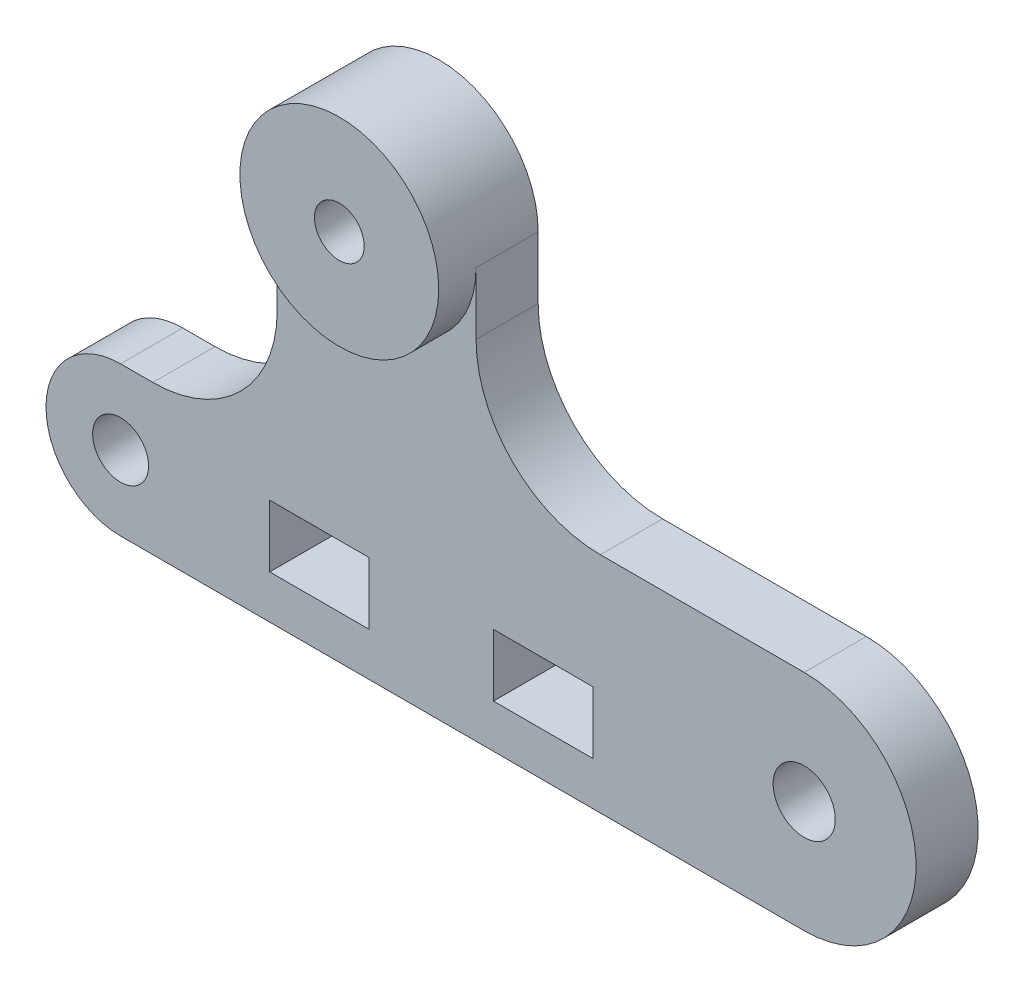
ISO-10303-21;
HEADER;
FILE_DESCRIPTION(('STEP AP214'),'2;1');
FILE_NAME('part.step','',(''),(''),'','','');
FILE_SCHEMA(('AUTOMOTIVE_DESIGN { 1 0 10303 214 1 1 1 1 }'));
ENDSEC;
DATA;
#1=APPLICATION_CONTEXT('core data for automotive mechanical design processes');
#2=APPLICATION_PROTOCOL_DEFINITION('international standard','automotive_design',2000,#1);
#3=PRODUCT_CONTEXT('',#1,'mechanical');
#4=PRODUCT('Part','Part','',(#3));
#5=PRODUCT_RELATED_PRODUCT_CATEGORY('part','',(#4));
#6=PRODUCT_DEFINITION_FORMATION('','',#4);
#7=PRODUCT_DEFINITION_CONTEXT('part definition',#1,'design');
#8=PRODUCT_DEFINITION('design','',#6,#7);
#9=PRODUCT_DEFINITION_SHAPE('','',#8);
#10=(LENGTH_UNIT() NAMED_UNIT(*) SI_UNIT(.MILLI.,.METRE.));
#11=(NAMED_UNIT(*) PLANE_ANGLE_UNIT() SI_UNIT($,.RADIAN.));
#12=(NAMED_UNIT(*) SI_UNIT($,.STERADIAN.) SOLID_ANGLE_UNIT());
#13=UNCERTAINTY_MEASURE_WITH_UNIT(LENGTH_MEASURE(1.E-05),#10,'distance_accuracy_value','');
#14=(GEOMETRIC_REPRESENTATION_CONTEXT(3) GLOBAL_UNCERTAINTY_ASSIGNED_CONTEXT((#13)) GLOBAL_UNIT_ASSIGNED_CONTEXT((#10,
#11,#12)) REPRESENTATION_CONTEXT('',''));
#15=CARTESIAN_POINT('',(0.,0.,0.));
#16=DIRECTION('',(0.,0.,1.));
#17=DIRECTION('',(1.,0.,0.));
#18=AXIS2_PLACEMENT_3D('',#15,#16,#17);
#19=CARTESIAN_POINT('',(-27.5,6.,2.5));
#20=DIRECTION('',(0.,0.,-1.));
#21=DIRECTION('',(-1.,0.,0.));
#22=AXIS2_PLACEMENT_3D('',#19,#20,#21);
#23=PLANE('',#22);
#24=CARTESIAN_POINT('',(-6.90000000000001,33.,2.5));
#25=DIRECTION('',(0.,0.,1.));
#26=DIRECTION('',(1.,0.,0.));
#27=AXIS2_PLACEMENT_3D('',#24,#25,#26);
#28=CIRCLE('',#27,8.);
#29=CARTESIAN_POINT('',(-14.9,33.,2.5));
#30=VERTEX_POINT('',#29);
#31=CARTESIAN_POINT('',(1.09999999999999,33.,2.5));
#32=VERTEX_POINT('',#31);
#33=EDGE_CURVE('E11',#30,#32,#28,.T.);
#34=ORIENTED_EDGE('',*,*,#33,.F.);
#35=DIRECTION('',(0.,-1.,0.));
#36=VECTOR('',#35,1.);
#37=CARTESIAN_POINT('',(-14.9,33.,2.5));
#38=LINE('',#37,#36);
#39=CARTESIAN_POINT('',(-14.9,22.0000000000001,2.5));
#40=VERTEX_POINT('',#39);
#41=EDGE_CURVE('E181',#30,#40,#38,.T.);
#42=ORIENTED_EDGE('',*,*,#41,.T.);
#43=CARTESIAN_POINT('',(-24.9,22.,2.5));
#44=DIRECTION('',(0.,0.,-1.));
#45=DIRECTION('',(-1.,0.,0.));
#46=AXIS2_PLACEMENT_3D('',#43,#44,#45);
#47=CIRCLE('',#46,10.);
#48=CARTESIAN_POINT('',(-24.9000000000001,12.,2.5));
#49=VERTEX_POINT('',#48);
#50=EDGE_CURVE('E196',#40,#49,#47,.T.);
#51=ORIENTED_EDGE('',*,*,#50,.T.);
#52=DIRECTION('',(-1.,0.,0.));
#53=VECTOR('',#52,1.);
#54=CARTESIAN_POINT('',(-24.9000000000001,12.,2.5));
#55=LINE('',#54,#53);
#56=CARTESIAN_POINT('',(-27.5,12.,2.5));
#57=VERTEX_POINT('',#56);
#58=EDGE_CURVE('E198',#49,#57,#55,.T.);
#59=ORIENTED_EDGE('',*,*,#58,.T.);
#60=CARTESIAN_POINT('',(-27.5,6.,2.5));
#61=DIRECTION('',(0.,0.,1.));
#62=DIRECTION('',(-1.,0.,0.));
#63=AXIS2_PLACEMENT_3D('',#60,#61,#62);
#64=CIRCLE('',#63,6.);
#65=CARTESIAN_POINT('',(-27.5,0.,2.5));
#66=VERTEX_POINT('',#65);
#67=EDGE_CURVE('E224',#57,#66,#64,.T.);
#68=ORIENTED_EDGE('',*,*,#67,.T.);
#69=DIRECTION('',(1.,0.,0.));
#70=VECTOR('',#69,1.);
#71=CARTESIAN_POINT('',(-27.5,0.,2.5));
#72=LINE('',#71,#70);
#73=CARTESIAN_POINT('',(27.5,0.,2.5));
#74=VERTEX_POINT('',#73);
#75=EDGE_CURVE('E247',#66,#74,#72,.T.);
#76=ORIENTED_EDGE('',*,*,#75,.T.);
#77=CARTESIAN_POINT('',(27.5,9.,2.5));
#78=DIRECTION('',(0.,0.,1.));
#79=DIRECTION('',(1.,0.,0.));
#80=AXIS2_PLACEMENT_3D('',#77,#78,#79);
#81=CIRCLE('',#80,8.99999999999999);
#82=CARTESIAN_POINT('',(27.5,18.,2.5));
#83=VERTEX_POINT('',#82);
#84=EDGE_CURVE('E267',#74,#83,#81,.T.);
#85=ORIENTED_EDGE('',*,*,#84,.T.);
#86=DIRECTION('',(-1.,0.,0.));
#87=VECTOR('',#86,1.);
#88=CARTESIAN_POINT('',(11.1000000000001,18.,2.5));
#89=LINE('',#88,#87);
#90=CARTESIAN_POINT('',(11.1000000000001,18.,2.5));
#91=VERTEX_POINT('',#90);
#92=EDGE_CURVE('E266',#83,#91,#89,.T.);
#93=ORIENTED_EDGE('',*,*,#92,.T.);
#94=CARTESIAN_POINT('',(11.1,28.,2.5));
#95=DIRECTION('',(0.,0.,-1.));
#96=DIRECTION('',(1.,0.,0.));
#97=AXIS2_PLACEMENT_3D('',#94,#95,#96);
#98=CIRCLE('',#97,10.);
#99=CARTESIAN_POINT('',(1.09999999999999,28.0000000000001,2.5));
#100=VERTEX_POINT('',#99);
#101=EDGE_CURVE('E179',#91,#100,#98,.T.);
#102=ORIENTED_EDGE('',*,*,#101,.T.);
#103=DIRECTION('',(0.,1.,0.));
#104=VECTOR('',#103,1.);
#105=CARTESIAN_POINT('',(1.09999999999999,33.,2.5));
#106=LINE('',#105,#104);
#107=EDGE_CURVE('E167',#100,#32,#106,.T.);
#108=ORIENTED_EDGE('',*,*,#107,.T.);
#109=EDGE_LOOP('',(#34,#42,#51,#59,#68,#76,#85,#93,#102,#108));
#110=FACE_BOUND('',#109,.T.);
#111=DIRECTION('',(0.,-1.,0.));
#112=VECTOR('',#111,1.);
#113=CARTESIAN_POINT('',(-15.5,3.5,2.5));
#114=LINE('',#113,#112);
#115=CARTESIAN_POINT('',(-15.5,8.5,2.5));
#116=VERTEX_POINT('',#115);
#117=CARTESIAN_POINT('',(-15.5,3.5,2.5));
#118=VERTEX_POINT('',#117);
#119=EDGE_CURVE('E305',#116,#118,#114,.T.);
#120=ORIENTED_EDGE('',*,*,#119,.F.);
#121=DIRECTION('',(-1.,0.,0.));
#122=VECTOR('',#121,1.);
#123=CARTESIAN_POINT('',(-15.5,8.5,2.5));
#124=LINE('',#123,#122);
#125=CARTESIAN_POINT('',(-7.5,8.5,2.5));
#126=VERTEX_POINT('',#125);
#127=EDGE_CURVE('E301',#126,#116,#124,.T.);
#128=ORIENTED_EDGE('',*,*,#127,.F.);
#129=DIRECTION('',(0.,1.,0.));
#130=VECTOR('',#129,1.);
#131=CARTESIAN_POINT('',(-7.5,3.5,2.5));
#132=LINE('',#131,#130);
#133=CARTESIAN_POINT('',(-7.5,3.5,2.5));
#134=VERTEX_POINT('',#133);
#135=EDGE_CURVE('E317',#134,#126,#132,.T.);
#136=ORIENTED_EDGE('',*,*,#135,.F.);
#137=DIRECTION('',(1.,0.,0.));
#138=VECTOR('',#137,1.);
#139=CARTESIAN_POINT('',(-15.5,3.5,2.5));
#140=LINE('',#139,#138);
#141=EDGE_CURVE('E320',#118,#134,#140,.T.);
#142=ORIENTED_EDGE('',*,*,#141,.F.);
#143=EDGE_LOOP('',(#120,#128,#136,#142));
#144=FACE_BOUND('',#143,.T.);
#145=CARTESIAN_POINT('',(-27.5,6.,2.5));
#146=DIRECTION('',(0.,0.,1.));
#147=DIRECTION('',(1.,0.,0.));
#148=AXIS2_PLACEMENT_3D('',#145,#146,#147);
#149=CIRCLE('',#148,2.25);
#150=CARTESIAN_POINT('',(-25.25,6.,2.5));
#151=VERTEX_POINT('',#150);
#152=EDGE_CURVE('E208',#151,#151,#149,.T.);
#153=ORIENTED_EDGE('',*,*,#152,.F.);
#154=EDGE_LOOP('',(#153));
#155=FACE_BOUND('',#154,.T.);
#156=CARTESIAN_POINT('',(27.5,9.,2.5));
#157=DIRECTION('',(0.,0.,1.));
#158=DIRECTION('',(1.,0.,0.));
#159=AXIS2_PLACEMENT_3D('',#156,#157,#158);
#160=CIRCLE('',#159,2.5);
#161=CARTESIAN_POINT('',(30.,9.,2.5));
#162=VERTEX_POINT('',#161);
#163=EDGE_CURVE('E281',#162,#162,#160,.T.);
#164=ORIENTED_EDGE('',*,*,#163,.F.);
#165=EDGE_LOOP('',(#164));
#166=FACE_BOUND('',#165,.T.);
#167=DIRECTION('',(0.,-1.,0.));
#168=VECTOR('',#167,1.);
#169=CARTESIAN_POINT('',(2.5,8.5,2.5));
#170=LINE('',#169,#168);
#171=CARTESIAN_POINT('',(2.5,8.5,2.5));
#172=VERTEX_POINT('',#171);
#173=CARTESIAN_POINT('',(2.5,3.5,2.5));
#174=VERTEX_POINT('',#173);
#175=EDGE_CURVE('E333',#172,#174,#170,.T.);
#176=ORIENTED_EDGE('',*,*,#175,.F.);
#177=DIRECTION('',(-1.,0.,0.));
#178=VECTOR('',#177,1.);
#179=CARTESIAN_POINT('',(2.5,8.5,2.5));
#180=LINE('',#179,#178);
#181=CARTESIAN_POINT('',(10.5,8.5,2.5));
#182=VERTEX_POINT('',#181);
#183=EDGE_CURVE('E329',#182,#172,#180,.T.);
#184=ORIENTED_EDGE('',*,*,#183,.F.);
#185=DIRECTION('',(0.,1.,0.));
#186=VECTOR('',#185,1.);
#187=CARTESIAN_POINT('',(10.5,8.5,2.5));
#188=LINE('',#187,#186);
#189=CARTESIAN_POINT('',(10.5,3.5,2.5));
#190=VERTEX_POINT('',#189);
#191=EDGE_CURVE('E342',#190,#182,#188,.T.);
#192=ORIENTED_EDGE('',*,*,#191,.F.);
#193=DIRECTION('',(1.,0.,0.));
#194=VECTOR('',#193,1.);
#195=CARTESIAN_POINT('',(2.5,3.5,2.5));
#196=LINE('',#195,#194);
#197=EDGE_CURVE('E344',#174,#190,#196,.T.);
#198=ORIENTED_EDGE('',*,*,#197,.F.);
#199=EDGE_LOOP('',(#176,#184,#192,#198));
#200=FACE_BOUND('',#199,.T.);
#201=ADVANCED_FACE('F35',(#110,#144,#155,#166,#200),#23,.F.);
#202=CARTESIAN_POINT('',(-27.5,6.,-2.5));
#203=DIRECTION('',(0.,0.,-1.));
#204=DIRECTION('',(-1.,0.,0.));
#205=AXIS2_PLACEMENT_3D('',#202,#203,#204);
#206=PLANE('',#205);
#207=CARTESIAN_POINT('',(-6.90000000000001,33.,-2.5));
#208=DIRECTION('',(0.,0.,1.));
#209=DIRECTION('',(1.,0.,0.));
#210=AXIS2_PLACEMENT_3D('',#207,#208,#209);
#211=CIRCLE('',#210,2.25);
#212=CARTESIAN_POINT('',(-4.65,33.,-2.5));
#213=VERTEX_POINT('',#212);
#214=EDGE_CURVE('E276',#213,#213,#211,.T.);
#215=ORIENTED_EDGE('',*,*,#214,.T.);
#216=EDGE_LOOP('',(#215));
#217=FACE_BOUND('',#216,.T.);
#218=CARTESIAN_POINT('',(-27.5,6.,-2.5));
#219=DIRECTION('',(0.,0.,1.));
#220=DIRECTION('',(-1.,0.,0.));
#221=AXIS2_PLACEMENT_3D('',#218,#219,#220);
#222=CIRCLE('',#221,6.);
#223=CARTESIAN_POINT('',(-27.5,12.,-2.5));
#224=VERTEX_POINT('',#223);
#225=CARTESIAN_POINT('',(-27.5,0.,-2.5));
#226=VERTEX_POINT('',#225);
#227=EDGE_CURVE('E204',#224,#226,#222,.T.);
#228=ORIENTED_EDGE('',*,*,#227,.F.);
#229=DIRECTION('',(-1.,0.,0.));
#230=VECTOR('',#229,1.);
#231=CARTESIAN_POINT('',(-24.9000000000001,12.,-2.5));
#232=LINE('',#231,#230);
#233=CARTESIAN_POINT('',(-24.9000000000001,12.,-2.5));
#234=VERTEX_POINT('',#233);
#235=EDGE_CURVE('E222',#234,#224,#232,.T.);
#236=ORIENTED_EDGE('',*,*,#235,.F.);
#237=CARTESIAN_POINT('',(-24.9,22.,-2.5));
#238=DIRECTION('',(0.,0.,-1.));
#239=DIRECTION('',(-1.,0.,0.));
#240=AXIS2_PLACEMENT_3D('',#237,#238,#239);
#241=CIRCLE('',#240,10.);
#242=CARTESIAN_POINT('',(-14.9,22.0000000000001,-2.5));
#243=VERTEX_POINT('',#242);
#244=EDGE_CURVE('E220',#243,#234,#241,.T.);
#245=ORIENTED_EDGE('',*,*,#244,.F.);
#246=DIRECTION('',(0.,-1.,0.));
#247=VECTOR('',#246,1.);
#248=CARTESIAN_POINT('',(-14.9,33.,-2.5));
#249=LINE('',#248,#247);
#250=CARTESIAN_POINT('',(-14.9,33.,-2.5));
#251=VERTEX_POINT('',#250);
#252=EDGE_CURVE('E218',#251,#243,#249,.T.);
#253=ORIENTED_EDGE('',*,*,#252,.F.);
#254=CARTESIAN_POINT('',(-6.90000000000001,33.,-2.5));
#255=DIRECTION('',(0.,0.,1.));
#256=DIRECTION('',(-1.,0.,0.));
#257=AXIS2_PLACEMENT_3D('',#254,#255,#256);
#258=CIRCLE('',#257,8.);
#259=CARTESIAN_POINT('',(1.09999999999999,33.,-2.5));
#260=VERTEX_POINT('',#259);
#261=EDGE_CURVE('E187',#260,#251,#258,.T.);
#262=ORIENTED_EDGE('',*,*,#261,.F.);
#263=DIRECTION('',(0.,1.,0.));
#264=VECTOR('',#263,1.);
#265=CARTESIAN_POINT('',(1.09999999999999,33.,-2.5));
#266=LINE('',#265,#264);
#267=CARTESIAN_POINT('',(1.09999999999999,28.0000000000001,-2.5));
#268=VERTEX_POINT('',#267);
#269=EDGE_CURVE('E169',#268,#260,#266,.T.);
#270=ORIENTED_EDGE('',*,*,#269,.F.);
#271=CARTESIAN_POINT('',(11.1,28.,-2.5));
#272=DIRECTION('',(0.,0.,-1.));
#273=DIRECTION('',(1.,0.,0.));
#274=AXIS2_PLACEMENT_3D('',#271,#272,#273);
#275=CIRCLE('',#274,10.);
#276=CARTESIAN_POINT('',(11.1000000000001,18.,-2.5));
#277=VERTEX_POINT('',#276);
#278=EDGE_CURVE('E214',#277,#268,#275,.T.);
#279=ORIENTED_EDGE('',*,*,#278,.F.);
#280=DIRECTION('',(-1.,0.,0.));
#281=VECTOR('',#280,1.);
#282=CARTESIAN_POINT('',(11.1000000000001,18.,-2.5));
#283=LINE('',#282,#281);
#284=CARTESIAN_POINT('',(27.5,18.,-2.5));
#285=VERTEX_POINT('',#284);
#286=EDGE_CURVE('E212',#285,#277,#283,.T.);
#287=ORIENTED_EDGE('',*,*,#286,.F.);
#288=CARTESIAN_POINT('',(27.5,9.,-2.5));
#289=DIRECTION('',(0.,0.,1.));
#290=DIRECTION('',(1.,0.,0.));
#291=AXIS2_PLACEMENT_3D('',#288,#289,#290);
#292=CIRCLE('',#291,8.99999999999999);
#293=CARTESIAN_POINT('',(27.5,0.,-2.5));
#294=VERTEX_POINT('',#293);
#295=EDGE_CURVE('E210',#294,#285,#292,.T.);
#296=ORIENTED_EDGE('',*,*,#295,.F.);
#297=DIRECTION('',(1.,0.,0.));
#298=VECTOR('',#297,1.);
#299=CARTESIAN_POINT('',(-27.5,0.,-2.5));
#300=LINE('',#299,#298);
#301=EDGE_CURVE('E207',#226,#294,#300,.T.);
#302=ORIENTED_EDGE('',*,*,#301,.F.);
#303=EDGE_LOOP('',(#228,#236,#245,#253,#262,#270,#279,#287,#296,#302));
#304=FACE_BOUND('',#303,.T.);
#305=CARTESIAN_POINT('',(-27.5,6.,-2.5));
#306=DIRECTION('',(0.,0.,1.));
#307=DIRECTION('',(1.,0.,0.));
#308=AXIS2_PLACEMENT_3D('',#305,#306,#307);
#309=CIRCLE('',#308,2.25);
#310=CARTESIAN_POINT('',(-25.25,6.,-2.5));
#311=VERTEX_POINT('',#310);
#312=EDGE_CURVE('E273',#311,#311,#309,.T.);
#313=ORIENTED_EDGE('',*,*,#312,.T.);
#314=EDGE_LOOP('',(#313));
#315=FACE_BOUND('',#314,.T.);
#316=CARTESIAN_POINT('',(27.5,9.,-2.5));
#317=DIRECTION('',(0.,0.,1.));
#318=DIRECTION('',(1.,0.,0.));
#319=AXIS2_PLACEMENT_3D('',#316,#317,#318);
#320=CIRCLE('',#319,2.5);
#321=CARTESIAN_POINT('',(30.,9.,-2.5));
#322=VERTEX_POINT('',#321);
#323=EDGE_CURVE('E286',#322,#322,#320,.T.);
#324=ORIENTED_EDGE('',*,*,#323,.T.);
#325=EDGE_LOOP('',(#324));
#326=FACE_BOUND('',#325,.T.);
#327=DIRECTION('',(-1.,0.,0.));
#328=VECTOR('',#327,1.);
#329=CARTESIAN_POINT('',(-15.5,8.5,-2.5));
#330=LINE('',#329,#328);
#331=CARTESIAN_POINT('',(-7.5,8.5,-2.5));
#332=VERTEX_POINT('',#331);
#333=CARTESIAN_POINT('',(-15.5,8.5,-2.5));
#334=VERTEX_POINT('',#333);
#335=EDGE_CURVE('E302',#332,#334,#330,.T.);
#336=ORIENTED_EDGE('',*,*,#335,.T.);
#337=DIRECTION('',(0.,-1.,0.));
#338=VECTOR('',#337,1.);
#339=CARTESIAN_POINT('',(-15.5,3.5,-2.5));
#340=LINE('',#339,#338);
#341=CARTESIAN_POINT('',(-15.5,3.5,-2.5));
#342=VERTEX_POINT('',#341);
#343=EDGE_CURVE('E312',#334,#342,#340,.T.);
#344=ORIENTED_EDGE('',*,*,#343,.T.);
#345=DIRECTION('',(1.,0.,0.));
#346=VECTOR('',#345,1.);
#347=CARTESIAN_POINT('',(-15.5,3.5,-2.5));
#348=LINE('',#347,#346);
#349=CARTESIAN_POINT('',(-7.5,3.5,-2.5));
#350=VERTEX_POINT('',#349);
#351=EDGE_CURVE('E309',#342,#350,#348,.T.);
#352=ORIENTED_EDGE('',*,*,#351,.T.);
#353=DIRECTION('',(0.,1.,0.));
#354=VECTOR('',#353,1.);
#355=CARTESIAN_POINT('',(-7.5,3.5,-2.5));
#356=LINE('',#355,#354);
#357=EDGE_CURVE('E306',#350,#332,#356,.T.);
#358=ORIENTED_EDGE('',*,*,#357,.T.);
#359=EDGE_LOOP('',(#336,#344,#352,#358));
#360=FACE_BOUND('',#359,.T.);
#361=DIRECTION('',(-1.,0.,0.));
#362=VECTOR('',#361,1.);
#363=CARTESIAN_POINT('',(2.5,8.5,-2.5));
#364=LINE('',#363,#362);
#365=CARTESIAN_POINT('',(10.5,8.5,-2.5));
#366=VERTEX_POINT('',#365);
#367=CARTESIAN_POINT('',(2.5,8.5,-2.5));
#368=VERTEX_POINT('',#367);
#369=EDGE_CURVE('E330',#366,#368,#364,.T.);
#370=ORIENTED_EDGE('',*,*,#369,.T.);
#371=DIRECTION('',(0.,-1.,0.));
#372=VECTOR('',#371,1.);
#373=CARTESIAN_POINT('',(2.5,8.5,-2.5));
#374=LINE('',#373,#372);
#375=CARTESIAN_POINT('',(2.5,3.5,-2.5));
#376=VERTEX_POINT('',#375);
#377=EDGE_CURVE('E59',#368,#376,#374,.T.);
#378=ORIENTED_EDGE('',*,*,#377,.T.);
#379=DIRECTION('',(1.,0.,0.));
#380=VECTOR('',#379,1.);
#381=CARTESIAN_POINT('',(2.5,3.5,-2.5));
#382=LINE('',#381,#380);
#383=CARTESIAN_POINT('',(10.5,3.5,-2.5));
#384=VERTEX_POINT('',#383);
#385=EDGE_CURVE('E337',#376,#384,#382,.T.);
#386=ORIENTED_EDGE('',*,*,#385,.T.);
#387=DIRECTION('',(0.,1.,0.));
#388=VECTOR('',#387,1.);
#389=CARTESIAN_POINT('',(10.5,8.5,-2.5));
#390=LINE('',#389,#388);
#391=EDGE_CURVE('E334',#384,#366,#390,.T.);
#392=ORIENTED_EDGE('',*,*,#391,.T.);
#393=EDGE_LOOP('',(#370,#378,#386,#392));
#394=FACE_BOUND('',#393,.T.);
#395=ADVANCED_FACE('F255',(#217,#304,#315,#326,#360,#394),#206,.T.);
#396=CARTESIAN_POINT('',(-27.5,6.,2.5));
#397=DIRECTION('',(0.,0.,-1.));
#398=DIRECTION('',(-1.,0.,0.));
#399=AXIS2_PLACEMENT_3D('',#396,#397,#398);
#400=CYLINDRICAL_SURFACE('',#399,6.);
#401=ORIENTED_EDGE('',*,*,#227,.T.);
#402=DIRECTION('',(0.,0.,-1.));
#403=VECTOR('',#402,1.);
#404=CARTESIAN_POINT('',(-27.5,0.,2.5));
#405=LINE('',#404,#403);
#406=EDGE_CURVE('E39',#66,#226,#405,.T.);
#407=ORIENTED_EDGE('',*,*,#406,.F.);
#408=ORIENTED_EDGE('',*,*,#67,.F.);
#409=DIRECTION('',(0.,0.,-1.));
#410=VECTOR('',#409,1.);
#411=CARTESIAN_POINT('',(-27.5,12.,2.5));
#412=LINE('',#411,#410);
#413=EDGE_CURVE('E203',#57,#224,#412,.T.);
#414=ORIENTED_EDGE('',*,*,#413,.T.);
#415=EDGE_LOOP('',(#401,#407,#408,#414));
#416=FACE_BOUND('',#415,.T.);
#417=ADVANCED_FACE('F37',(#416),#400,.T.);
#418=CARTESIAN_POINT('',(-27.5,0.,2.5));
#419=DIRECTION('',(0.,1.,0.));
#420=DIRECTION('',(-1.,0.,0.));
#421=AXIS2_PLACEMENT_3D('',#418,#419,#420);
#422=PLANE('',#421);
#423=ORIENTED_EDGE('',*,*,#301,.T.);
#424=DIRECTION('',(0.,0.,-1.));
#425=VECTOR('',#424,1.);
#426=CARTESIAN_POINT('',(27.5,0.,2.5));
#427=LINE('',#426,#425);
#428=EDGE_CURVE('E237',#74,#294,#427,.T.);
#429=ORIENTED_EDGE('',*,*,#428,.F.);
#430=ORIENTED_EDGE('',*,*,#75,.F.);
#431=ORIENTED_EDGE('',*,*,#406,.T.);
#432=EDGE_LOOP('',(#423,#429,#430,#431));
#433=FACE_BOUND('',#432,.T.);
#434=ADVANCED_FACE('F246',(#433),#422,.F.);
#435=CARTESIAN_POINT('',(27.5,9.,2.5));
#436=DIRECTION('',(0.,0.,-1.));
#437=DIRECTION('',(-1.,0.,0.));
#438=AXIS2_PLACEMENT_3D('',#435,#436,#437);
#439=CYLINDRICAL_SURFACE('',#438,8.99999999999999);
#440=ORIENTED_EDGE('',*,*,#295,.T.);
#441=DIRECTION('',(0.,0.,-1.));
#442=VECTOR('',#441,1.);
#443=CARTESIAN_POINT('',(27.5,18.,2.5));
#444=LINE('',#443,#442);
#445=EDGE_CURVE('E235',#83,#285,#444,.T.);
#446=ORIENTED_EDGE('',*,*,#445,.F.);
#447=ORIENTED_EDGE('',*,*,#84,.F.);
#448=ORIENTED_EDGE('',*,*,#428,.T.);
#449=EDGE_LOOP('',(#440,#446,#447,#448));
#450=FACE_BOUND('',#449,.T.);
#451=ADVANCED_FACE('F261',(#450),#439,.T.);
#452=CARTESIAN_POINT('',(11.1000000000001,18.,2.5));
#453=DIRECTION('',(0.,-1.,0.));
#454=DIRECTION('',(0.,0.,-1.));
#455=AXIS2_PLACEMENT_3D('',#452,#453,#454);
#456=PLANE('',#455);
#457=ORIENTED_EDGE('',*,*,#286,.T.);
#458=DIRECTION('',(0.,0.,-1.));
#459=VECTOR('',#458,1.);
#460=CARTESIAN_POINT('',(11.1000000000001,18.,2.5));
#461=LINE('',#460,#459);
#462=EDGE_CURVE('E232',#91,#277,#461,.T.);
#463=ORIENTED_EDGE('',*,*,#462,.F.);
#464=ORIENTED_EDGE('',*,*,#92,.F.);
#465=ORIENTED_EDGE('',*,*,#445,.T.);
#466=EDGE_LOOP('',(#457,#463,#464,#465));
#467=FACE_BOUND('',#466,.T.);
#468=ADVANCED_FACE('F264',(#467),#456,.F.);
#469=CARTESIAN_POINT('',(11.1,28.,2.5));
#470=DIRECTION('',(0.,0.,-1.));
#471=DIRECTION('',(-1.,0.,0.));
#472=AXIS2_PLACEMENT_3D('',#469,#470,#471);
#473=CYLINDRICAL_SURFACE('',#472,10.);
#474=ORIENTED_EDGE('',*,*,#278,.T.);
#475=DIRECTION('',(0.,0.,-1.));
#476=VECTOR('',#475,1.);
#477=CARTESIAN_POINT('',(1.09999999999999,28.0000000000001,2.5));
#478=LINE('',#477,#476);
#479=EDGE_CURVE('E172',#100,#268,#478,.T.);
#480=ORIENTED_EDGE('',*,*,#479,.F.);
#481=ORIENTED_EDGE('',*,*,#101,.F.);
#482=ORIENTED_EDGE('',*,*,#462,.T.);
#483=EDGE_LOOP('',(#474,#480,#481,#482));
#484=FACE_BOUND('',#483,.T.);
#485=ADVANCED_FACE('F399',(#484),#473,.F.);
#486=CARTESIAN_POINT('',(1.09999999999999,33.,2.5));
#487=DIRECTION('',(-1.,0.,0.));
#488=DIRECTION('',(0.,0.,1.));
#489=AXIS2_PLACEMENT_3D('',#486,#487,#488);
#490=PLANE('',#489);
#491=ORIENTED_EDGE('',*,*,#269,.T.);
#492=DIRECTION('',(0.,0.,-1.));
#493=VECTOR('',#492,1.);
#494=CARTESIAN_POINT('',(1.09999999999999,33.,2.5));
#495=LINE('',#494,#493);
#496=EDGE_CURVE('E163',#32,#260,#495,.T.);
#497=ORIENTED_EDGE('',*,*,#496,.F.);
#498=ORIENTED_EDGE('',*,*,#107,.F.);
#499=ORIENTED_EDGE('',*,*,#479,.T.);
#500=EDGE_LOOP('',(#491,#497,#498,#499));
#501=FACE_BOUND('',#500,.T.);
#502=ADVANCED_FACE('F165',(#501),#490,.F.);
#503=CARTESIAN_POINT('',(-6.90000000000001,33.,2.5));
#504=DIRECTION('',(0.,0.,-1.));
#505=DIRECTION('',(-1.,0.,0.));
#506=AXIS2_PLACEMENT_3D('',#503,#504,#505);
#507=CYLINDRICAL_SURFACE('',#506,8.);
#508=ORIENTED_EDGE('',*,*,#261,.T.);
#509=DIRECTION('',(0.,0.,-1.));
#510=VECTOR('',#509,1.);
#511=CARTESIAN_POINT('',(-14.9,33.,2.5));
#512=LINE('',#511,#510);
#513=EDGE_CURVE('E173',#30,#251,#512,.T.);
#514=ORIENTED_EDGE('',*,*,#513,.F.);
#515=ORIENTED_EDGE('',*,*,#33,.T.);
#516=ORIENTED_EDGE('',*,*,#496,.T.);
#517=EDGE_LOOP('',(#508,#514,#515,#516));
#518=FACE_BOUND('',#517,.T.);
#519=CARTESIAN_POINT('',(-6.90000000000001,33.,5.5));
#520=DIRECTION('',(0.,0.,1.));
#521=DIRECTION('',(1.,0.,0.));
#522=AXIS2_PLACEMENT_3D('',#519,#520,#521);
#523=CIRCLE('',#522,8.);
#524=CARTESIAN_POINT('',(1.09999999999999,33.,5.5));
#525=VERTEX_POINT('',#524);
#526=EDGE_CURVE('E285',#525,#525,#523,.T.);
#527=ORIENTED_EDGE('',*,*,#526,.F.);
#528=EDGE_LOOP('',(#527));
#529=FACE_BOUND('',#528,.T.);
#530=ADVANCED_FACE('F183',(#518,#529),#507,.T.);
#531=CARTESIAN_POINT('',(-14.9,33.,2.5));
#532=DIRECTION('',(1.,0.,0.));
#533=DIRECTION('',(0.,0.,-1.));
#534=AXIS2_PLACEMENT_3D('',#531,#532,#533);
#535=PLANE('',#534);
#536=ORIENTED_EDGE('',*,*,#252,.T.);
#537=DIRECTION('',(0.,0.,-1.));
#538=VECTOR('',#537,1.);
#539=CARTESIAN_POINT('',(-14.9,22.0000000000001,2.5));
#540=LINE('',#539,#538);
#541=EDGE_CURVE('E190',#40,#243,#540,.T.);
#542=ORIENTED_EDGE('',*,*,#541,.F.);
#543=ORIENTED_EDGE('',*,*,#41,.F.);
#544=ORIENTED_EDGE('',*,*,#513,.T.);
#545=EDGE_LOOP('',(#536,#542,#543,#544));
#546=FACE_BOUND('',#545,.T.);
#547=ADVANCED_FACE('F193',(#546),#535,.F.);
#548=CARTESIAN_POINT('',(-24.9,22.,2.5));
#549=DIRECTION('',(0.,0.,-1.));
#550=DIRECTION('',(-1.,0.,0.));
#551=AXIS2_PLACEMENT_3D('',#548,#549,#550);
#552=CYLINDRICAL_SURFACE('',#551,10.);
#553=ORIENTED_EDGE('',*,*,#244,.T.);
#554=DIRECTION('',(0.,0.,-1.));
#555=VECTOR('',#554,1.);
#556=CARTESIAN_POINT('',(-24.9000000000001,12.,2.5));
#557=LINE('',#556,#555);
#558=EDGE_CURVE('E227',#49,#234,#557,.T.);
#559=ORIENTED_EDGE('',*,*,#558,.F.);
#560=ORIENTED_EDGE('',*,*,#50,.F.);
#561=ORIENTED_EDGE('',*,*,#541,.T.);
#562=EDGE_LOOP('',(#553,#559,#560,#561));
#563=FACE_BOUND('',#562,.T.);
#564=ADVANCED_FACE('F388',(#563),#552,.F.);
#565=CARTESIAN_POINT('',(-24.9000000000001,12.,2.5));
#566=DIRECTION('',(0.,-1.,0.));
#567=DIRECTION('',(0.,0.,-1.));
#568=AXIS2_PLACEMENT_3D('',#565,#566,#567);
#569=PLANE('',#568);
#570=ORIENTED_EDGE('',*,*,#235,.T.);
#571=ORIENTED_EDGE('',*,*,#413,.F.);
#572=ORIENTED_EDGE('',*,*,#58,.F.);
#573=ORIENTED_EDGE('',*,*,#558,.T.);
#574=EDGE_LOOP('',(#570,#571,#572,#573));
#575=FACE_BOUND('',#574,.T.);
#576=ADVANCED_FACE('F385',(#575),#569,.F.);
#577=CARTESIAN_POINT('',(-27.5,6.,2.5));
#578=DIRECTION('',(0.,0.,-1.));
#579=DIRECTION('',(-1.,0.,0.));
#580=AXIS2_PLACEMENT_3D('',#577,#578,#579);
#581=CYLINDRICAL_SURFACE('',#580,2.25);
#582=ORIENTED_EDGE('',*,*,#152,.T.);
#583=EDGE_LOOP('',(#582));
#584=FACE_BOUND('',#583,.T.);
#585=ORIENTED_EDGE('',*,*,#312,.F.);
#586=EDGE_LOOP('',(#585));
#587=FACE_BOUND('',#586,.T.);
#588=ADVANCED_FACE('F382',(#584,#587),#581,.F.);
#589=CARTESIAN_POINT('',(-6.90000000000001,33.,2.5));
#590=DIRECTION('',(0.,0.,-1.));
#591=DIRECTION('',(-1.,0.,0.));
#592=AXIS2_PLACEMENT_3D('',#589,#590,#591);
#593=CYLINDRICAL_SURFACE('',#592,2.25);
#594=CARTESIAN_POINT('',(-6.90000000000001,33.,2.5));
#595=DIRECTION('',(0.,0.,1.));
#596=DIRECTION('',(1.,0.,0.));
#597=AXIS2_PLACEMENT_3D('',#594,#595,#596);
#598=CIRCLE('',#597,2.25);
#599=CARTESIAN_POINT('',(-4.65,33.,2.5));
#600=VERTEX_POINT('',#599);
#601=EDGE_CURVE('E282',#600,#600,#598,.T.);
#602=ORIENTED_EDGE('',*,*,#601,.T.);
#603=EDGE_LOOP('',(#602));
#604=FACE_BOUND('',#603,.T.);
#605=ORIENTED_EDGE('',*,*,#214,.F.);
#606=EDGE_LOOP('',(#605));
#607=FACE_BOUND('',#606,.T.);
#608=ADVANCED_FACE('F479',(#604,#607),#593,.F.);
#609=CARTESIAN_POINT('',(27.5,9.,2.5));
#610=DIRECTION('',(0.,0.,-1.));
#611=DIRECTION('',(-1.,0.,0.));
#612=AXIS2_PLACEMENT_3D('',#609,#610,#611);
#613=CYLINDRICAL_SURFACE('',#612,2.5);
#614=ORIENTED_EDGE('',*,*,#163,.T.);
#615=EDGE_LOOP('',(#614));
#616=FACE_BOUND('',#615,.T.);
#617=ORIENTED_EDGE('',*,*,#323,.F.);
#618=EDGE_LOOP('',(#617));
#619=FACE_BOUND('',#618,.T.);
#620=ADVANCED_FACE('F487',(#616,#619),#613,.F.);
#621=CARTESIAN_POINT('',(-15.5,3.5,2.5));
#622=DIRECTION('',(1.,0.,0.));
#623=DIRECTION('',(0.,0.,-1.));
#624=AXIS2_PLACEMENT_3D('',#621,#622,#623);
#625=PLANE('',#624);
#626=ORIENTED_EDGE('',*,*,#343,.F.);
#627=DIRECTION('',(0.,0.,-1.));
#628=VECTOR('',#627,1.);
#629=CARTESIAN_POINT('',(-15.5,8.5,2.5));
#630=LINE('',#629,#628);
#631=EDGE_CURVE('E298',#116,#334,#630,.T.);
#632=ORIENTED_EDGE('',*,*,#631,.F.);
#633=ORIENTED_EDGE('',*,*,#119,.T.);
#634=DIRECTION('',(0.,0.,-1.));
#635=VECTOR('',#634,1.);
#636=CARTESIAN_POINT('',(-15.5,3.5,2.5));
#637=LINE('',#636,#635);
#638=EDGE_CURVE('E289',#118,#342,#637,.T.);
#639=ORIENTED_EDGE('',*,*,#638,.T.);
#640=EDGE_LOOP('',(#626,#632,#633,#639));
#641=FACE_BOUND('',#640,.T.);
#642=ADVANCED_FACE('F495',(#641),#625,.T.);
#643=CARTESIAN_POINT('',(-15.5,3.5,2.5));
#644=DIRECTION('',(0.,1.,0.));
#645=DIRECTION('',(-1.,0.,0.));
#646=AXIS2_PLACEMENT_3D('',#643,#644,#645);
#647=PLANE('',#646);
#648=ORIENTED_EDGE('',*,*,#351,.F.);
#649=ORIENTED_EDGE('',*,*,#638,.F.);
#650=ORIENTED_EDGE('',*,*,#141,.T.);
#651=DIRECTION('',(0.,0.,-1.));
#652=VECTOR('',#651,1.);
#653=CARTESIAN_POINT('',(-7.5,3.5,2.5));
#654=LINE('',#653,#652);
#655=EDGE_CURVE('E294',#134,#350,#654,.T.);
#656=ORIENTED_EDGE('',*,*,#655,.T.);
#657=EDGE_LOOP('',(#648,#649,#650,#656));
#658=FACE_BOUND('',#657,.T.);
#659=ADVANCED_FACE('F504',(#658),#647,.T.);
#660=CARTESIAN_POINT('',(-7.5,3.5,2.5));
#661=DIRECTION('',(-1.,0.,0.));
#662=DIRECTION('',(0.,0.,1.));
#663=AXIS2_PLACEMENT_3D('',#660,#661,#662);
#664=PLANE('',#663);
#665=ORIENTED_EDGE('',*,*,#357,.F.);
#666=ORIENTED_EDGE('',*,*,#655,.F.);
#667=ORIENTED_EDGE('',*,*,#135,.T.);
#668=DIRECTION('',(0.,0.,-1.));
#669=VECTOR('',#668,1.);
#670=CARTESIAN_POINT('',(-7.5,8.5,2.5));
#671=LINE('',#670,#669);
#672=EDGE_CURVE('E296',#126,#332,#671,.T.);
#673=ORIENTED_EDGE('',*,*,#672,.T.);
#674=EDGE_LOOP('',(#665,#666,#667,#673));
#675=FACE_BOUND('',#674,.T.);
#676=ADVANCED_FACE('F513',(#675),#664,.T.);
#677=CARTESIAN_POINT('',(-15.5,8.5,2.5));
#678=DIRECTION('',(0.,-1.,0.));
#679=DIRECTION('',(0.,0.,-1.));
#680=AXIS2_PLACEMENT_3D('',#677,#678,#679);
#681=PLANE('',#680);
#682=ORIENTED_EDGE('',*,*,#335,.F.);
#683=ORIENTED_EDGE('',*,*,#672,.F.);
#684=ORIENTED_EDGE('',*,*,#127,.T.);
#685=ORIENTED_EDGE('',*,*,#631,.T.);
#686=EDGE_LOOP('',(#682,#683,#684,#685));
#687=FACE_BOUND('',#686,.T.);
#688=ADVANCED_FACE('F522',(#687),#681,.T.);
#689=CARTESIAN_POINT('',(2.5,8.5,2.5));
#690=DIRECTION('',(1.,0.,0.));
#691=DIRECTION('',(0.,0.,-1.));
#692=AXIS2_PLACEMENT_3D('',#689,#690,#691);
#693=PLANE('',#692);
#694=ORIENTED_EDGE('',*,*,#377,.F.);
#695=DIRECTION('',(0.,0.,-1.));
#696=VECTOR('',#695,1.);
#697=CARTESIAN_POINT('',(2.5,8.5,2.5));
#698=LINE('',#697,#696);
#699=EDGE_CURVE('E327',#172,#368,#698,.T.);
#700=ORIENTED_EDGE('',*,*,#699,.F.);
#701=ORIENTED_EDGE('',*,*,#175,.T.);
#702=DIRECTION('',(0.,0.,-1.));
#703=VECTOR('',#702,1.);
#704=CARTESIAN_POINT('',(2.5,3.5,2.5));
#705=LINE('',#704,#703);
#706=EDGE_CURVE('E315',#174,#376,#705,.T.);
#707=ORIENTED_EDGE('',*,*,#706,.T.);
#708=EDGE_LOOP('',(#694,#700,#701,#707));
#709=FACE_BOUND('',#708,.T.);
#710=ADVANCED_FACE('F531',(#709),#693,.T.);
#711=CARTESIAN_POINT('',(2.5,3.5,2.5));
#712=DIRECTION('',(0.,1.,0.));
#713=DIRECTION('',(-1.,0.,0.));
#714=AXIS2_PLACEMENT_3D('',#711,#712,#713);
#715=PLANE('',#714);
#716=ORIENTED_EDGE('',*,*,#385,.F.);
#717=ORIENTED_EDGE('',*,*,#706,.F.);
#718=ORIENTED_EDGE('',*,*,#197,.T.);
#719=DIRECTION('',(0.,0.,-1.));
#720=VECTOR('',#719,1.);
#721=CARTESIAN_POINT('',(10.5,3.5,2.5));
#722=LINE('',#721,#720);
#723=EDGE_CURVE('E324',#190,#384,#722,.T.);
#724=ORIENTED_EDGE('',*,*,#723,.T.);
#725=EDGE_LOOP('',(#716,#717,#718,#724));
#726=FACE_BOUND('',#725,.T.);
#727=ADVANCED_FACE('F540',(#726),#715,.T.);
#728=CARTESIAN_POINT('',(10.5,8.5,2.5));
#729=DIRECTION('',(-1.,0.,0.));
#730=DIRECTION('',(0.,0.,1.));
#731=AXIS2_PLACEMENT_3D('',#728,#729,#730);
#732=PLANE('',#731);
#733=ORIENTED_EDGE('',*,*,#391,.F.);
#734=ORIENTED_EDGE('',*,*,#723,.F.);
#735=ORIENTED_EDGE('',*,*,#191,.T.);
#736=DIRECTION('',(0.,0.,-1.));
#737=VECTOR('',#736,1.);
#738=CARTESIAN_POINT('',(10.5,8.5,2.5));
#739=LINE('',#738,#737);
#740=EDGE_CURVE('E51',#182,#366,#739,.T.);
#741=ORIENTED_EDGE('',*,*,#740,.T.);
#742=EDGE_LOOP('',(#733,#734,#735,#741));
#743=FACE_BOUND('',#742,.T.);
#744=ADVANCED_FACE('F371',(#743),#732,.T.);
#745=CARTESIAN_POINT('',(2.5,8.5,2.5));
#746=DIRECTION('',(0.,-1.,0.));
#747=DIRECTION('',(0.,0.,-1.));
#748=AXIS2_PLACEMENT_3D('',#745,#746,#747);
#749=PLANE('',#748);
#750=ORIENTED_EDGE('',*,*,#369,.F.);
#751=ORIENTED_EDGE('',*,*,#740,.F.);
#752=ORIENTED_EDGE('',*,*,#183,.T.);
#753=ORIENTED_EDGE('',*,*,#699,.T.);
#754=EDGE_LOOP('',(#750,#751,#752,#753));
#755=FACE_BOUND('',#754,.T.);
#756=ADVANCED_FACE('F362',(#755),#749,.T.);
#757=CARTESIAN_POINT('',(-6.90000000000001,33.,5.5));
#758=DIRECTION('',(0.,0.,1.));
#759=DIRECTION('',(1.,0.,0.));
#760=AXIS2_PLACEMENT_3D('',#757,#758,#759);
#761=PLANE('',#760);
#762=ORIENTED_EDGE('',*,*,#526,.T.);
#763=EDGE_LOOP('',(#762));
#764=FACE_BOUND('',#763,.T.);
#765=CARTESIAN_POINT('',(-6.90000000000001,33.,5.5));
#766=DIRECTION('',(0.,0.,1.));
#767=DIRECTION('',(1.,0.,0.));
#768=AXIS2_PLACEMENT_3D('',#765,#766,#767);
#769=CIRCLE('',#768,2.);
#770=CARTESIAN_POINT('',(-4.9,33.,5.5));
#771=VERTEX_POINT('',#770);
#772=EDGE_CURVE('E349',#771,#771,#769,.T.);
#773=ORIENTED_EDGE('',*,*,#772,.F.);
#774=EDGE_LOOP('',(#773));
#775=FACE_BOUND('',#774,.T.);
#776=ADVANCED_FACE('F359',(#764,#775),#761,.T.);
#777=CARTESIAN_POINT('',(-6.90000000000001,33.,2.5));
#778=DIRECTION('',(0.,0.,1.));
#779=DIRECTION('',(1.,0.,0.));
#780=AXIS2_PLACEMENT_3D('',#777,#778,#779);
#781=PLANE('',#780);
#782=ORIENTED_EDGE('',*,*,#601,.F.);
#783=EDGE_LOOP('',(#782));
#784=FACE_BOUND('',#783,.T.);
#785=CARTESIAN_POINT('',(-6.90000000000001,33.,2.5));
#786=DIRECTION('',(0.,0.,1.));
#787=DIRECTION('',(1.,0.,0.));
#788=AXIS2_PLACEMENT_3D('',#785,#786,#787);
#789=CIRCLE('',#788,2.);
#790=CARTESIAN_POINT('',(-4.9,33.,2.5));
#791=VERTEX_POINT('',#790);
#792=EDGE_CURVE('E350',#791,#791,#789,.T.);
#793=ORIENTED_EDGE('',*,*,#792,.T.);
#794=EDGE_LOOP('',(#793));
#795=FACE_BOUND('',#794,.T.);
#796=ADVANCED_FACE('F361',(#784,#795),#781,.F.);
#797=CARTESIAN_POINT('',(-6.90000000000001,33.,5.5));
#798=DIRECTION('',(0.,0.,-1.));
#799=DIRECTION('',(-1.,0.,0.));
#800=AXIS2_PLACEMENT_3D('',#797,#798,#799);
#801=CYLINDRICAL_SURFACE('',#800,2.);
#802=ORIENTED_EDGE('',*,*,#772,.T.);
#803=EDGE_LOOP('',(#802));
#804=FACE_BOUND('',#803,.T.);
#805=ORIENTED_EDGE('',*,*,#792,.F.);
#806=EDGE_LOOP('',(#805));
#807=FACE_BOUND('',#806,.T.);
#808=ADVANCED_FACE('F356',(#804,#807),#801,.F.);
#809=CLOSED_SHELL('',(#201,#395,#417,#434,#451,#468,#485,#502,#530,#547,#564,#576,#588,#608,
#620,#642,#659,#676,#688,#710,#727,#744,#756,#776,#796,#808));
#810=MANIFOLD_SOLID_BREP('B2',#809);
#811=ADVANCED_BREP_SHAPE_REPRESENTATION('',(#18,#810),#14);
#812=SHAPE_DEFINITION_REPRESENTATION(#9,#811);
ENDSEC;
END-ISO-10303-21;
